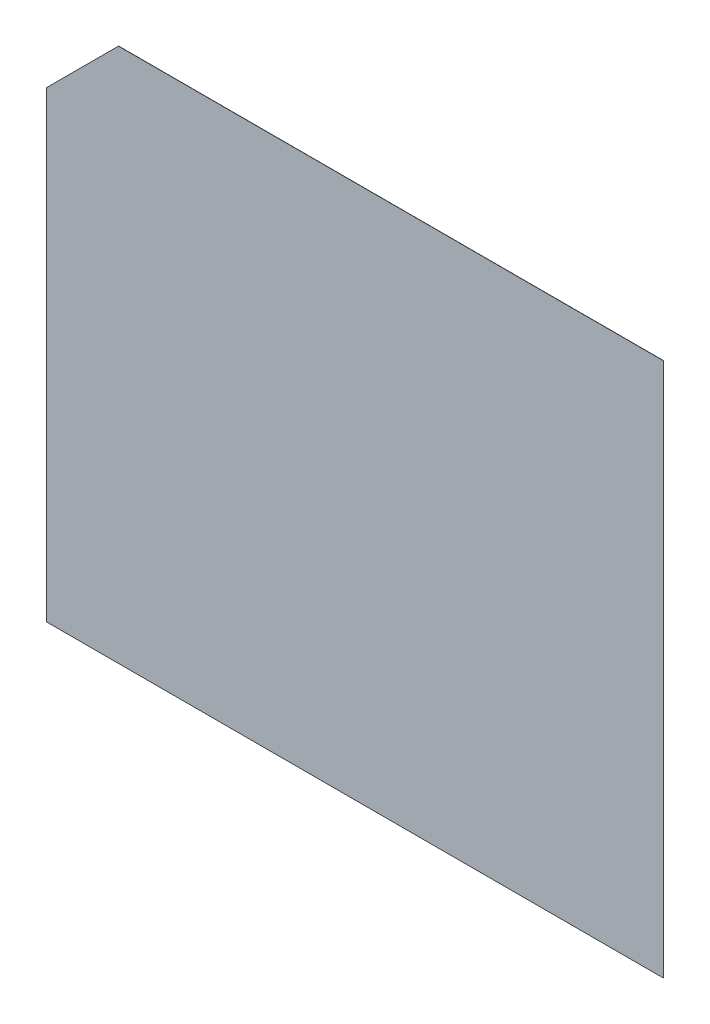
ISO-10303-21;
HEADER;
FILE_DESCRIPTION(('STEP AP214'),'2;1');
FILE_NAME('part.step','',(''),(''),'','','');
FILE_SCHEMA(('AUTOMOTIVE_DESIGN { 1 0 10303 214 1 1 1 1 }'));
ENDSEC;
DATA;
#1=APPLICATION_CONTEXT('core data for automotive mechanical design processes');
#2=APPLICATION_PROTOCOL_DEFINITION('international standard','automotive_design',2000,#1);
#3=PRODUCT_CONTEXT('',#1,'mechanical');
#4=PRODUCT('Part','Part','',(#3));
#5=PRODUCT_RELATED_PRODUCT_CATEGORY('part','',(#4));
#6=PRODUCT_DEFINITION_FORMATION('','',#4);
#7=PRODUCT_DEFINITION_CONTEXT('part definition',#1,'design');
#8=PRODUCT_DEFINITION('design','',#6,#7);
#9=PRODUCT_DEFINITION_SHAPE('','',#8);
#10=(LENGTH_UNIT() NAMED_UNIT(*) SI_UNIT(.MILLI.,.METRE.));
#11=(NAMED_UNIT(*) PLANE_ANGLE_UNIT() SI_UNIT($,.RADIAN.));
#12=(NAMED_UNIT(*) SI_UNIT($,.STERADIAN.) SOLID_ANGLE_UNIT());
#13=UNCERTAINTY_MEASURE_WITH_UNIT(LENGTH_MEASURE(1.E-05),#10,'distance_accuracy_value','');
#14=(GEOMETRIC_REPRESENTATION_CONTEXT(3) GLOBAL_UNCERTAINTY_ASSIGNED_CONTEXT((#13)) GLOBAL_UNIT_ASSIGNED_CONTEXT((#10,
#11,#12)) REPRESENTATION_CONTEXT('',''));
#15=CARTESIAN_POINT('',(0.,0.,0.));
#16=DIRECTION('',(0.,0.,1.));
#17=DIRECTION('',(1.,0.,0.));
#18=AXIS2_PLACEMENT_3D('',#15,#16,#17);
#19=CARTESIAN_POINT('',(-23.5424433175421,-3.51260628656114,-9.90996384610974E-05));
#20=CARTESIAN_POINT('',(-23.5424433175421,-3.51260628666604,0.00110090036153906));
#21=CARTESIAN_POINT('',(-23.5424431811625,-0.392606286561145,-9.88268795312018E-05));
#22=CARTESIAN_POINT('',(-23.5424431811625,-0.392606286666052,0.00110117312046896));
#23=(BOUNDED_SURFACE() B_SPLINE_SURFACE(1,1,((#19,#20),(#21,#22)),.UNSPECIFIED.,.F.,.F.,
.F.) B_SPLINE_SURFACE_WITH_KNOTS((2,2),(2,2),(-0.00026,0.00286),(-1.10000000000015E-06,
1.00000000000014E-07),
.UNSPECIFIED.) GEOMETRIC_REPRESENTATION_ITEM() RATIONAL_B_SPLINE_SURFACE(((1.,1.),(1.,1.))) REPRESENTATION_ITEM('') SURFACE());
#24=CARTESIAN_POINT('',(-23.5424431925275,-0.652606286657309,0.00100115039055812));
#25=CARTESIAN_POINT('',(-23.5424433061771,-3.2526062866573,0.00100092309144987));
#26=(BOUNDED_CURVE() B_SPLINE_CURVE(1,(#24,#25),.UNSPECIFIED.,.F.,
.F.) B_SPLINE_CURVE_WITH_KNOTS((2,2),(0.,0.0026),
.UNSPECIFIED.) CURVE() GEOMETRIC_REPRESENTATION_ITEM() RATIONAL_B_SPLINE_CURVE((1.,1.)) REPRESENTATION_ITEM(''));
#27=CARTESIAN_POINT('',(-23.5424431925275,-0.652606286657309,0.00100115039055812));
#28=VERTEX_POINT('',#27);
#29=CARTESIAN_POINT('',(-23.542443306177,-3.2526062866573,0.00100092309144976));
#30=VERTEX_POINT('',#29);
#31=EDGE_CURVE('E116',#28,#30,#26,.T.);
#32=CARTESIAN_POINT('',(-23.542443306177,-3.2526062866573,0.00100092309144976));
#33=CARTESIAN_POINT('',(-23.542443306177,-3.25260628656988,9.23091450066437E-07));
#34=(BOUNDED_CURVE() B_SPLINE_CURVE(1,(#32,#33),.UNSPECIFIED.,.F.,
.F.) B_SPLINE_CURVE_WITH_KNOTS((2,2),(0.,9.99999999999694E-07),
.UNSPECIFIED.) CURVE() GEOMETRIC_REPRESENTATION_ITEM() RATIONAL_B_SPLINE_CURVE((1.,1.)) REPRESENTATION_ITEM(''));
#35=CARTESIAN_POINT('',(-23.542443306177,-3.25260628656988,9.23091450066166E-07));
#36=VERTEX_POINT('',#35);
#37=EDGE_CURVE('E11',#30,#36,#34,.T.);
#38=CARTESIAN_POINT('',(-23.5424431925275,-0.652606286569893,1.1503905579871E-06));
#39=CARTESIAN_POINT('',(-23.5424433061771,-3.25260628656988,9.23091449740737E-07));
#40=(BOUNDED_CURVE() B_SPLINE_CURVE(1,(#38,#39),.UNSPECIFIED.,.F.,
.F.) B_SPLINE_CURVE_WITH_KNOTS((2,2),(0.,0.0026),
.UNSPECIFIED.) CURVE() GEOMETRIC_REPRESENTATION_ITEM() RATIONAL_B_SPLINE_CURVE((1.,1.)) REPRESENTATION_ITEM(''));
#41=CARTESIAN_POINT('',(-23.5424431925275,-0.652606286569893,1.1503905579871E-06));
#42=VERTEX_POINT('',#41);
#43=EDGE_CURVE('E101',#42,#36,#40,.T.);
#44=CARTESIAN_POINT('',(-23.5424431925275,-0.652606286657309,0.00100115039055812));
#45=CARTESIAN_POINT('',(-23.5424431925275,-0.652606286569886,1.15039055798751E-06));
#46=(BOUNDED_CURVE() B_SPLINE_CURVE(1,(#44,#45),.UNSPECIFIED.,.F.,
.F.) B_SPLINE_CURVE_WITH_KNOTS((2,2),(0.,1.00000000000013E-06),
.UNSPECIFIED.) CURVE() GEOMETRIC_REPRESENTATION_ITEM() RATIONAL_B_SPLINE_CURVE((1.,1.)) REPRESENTATION_ITEM(''));
#47=EDGE_CURVE('E73',#28,#42,#46,.T.);
#48=ORIENTED_EDGE('',*,*,#31,.T.);
#49=ORIENTED_EDGE('',*,*,#37,.T.);
#50=ORIENTED_EDGE('',*,*,#43,.F.);
#51=ORIENTED_EDGE('',*,*,#47,.F.);
#52=EDGE_LOOP('',(#48,#49,#50,#51));
#53=FACE_BOUND('',#52,.T.);
#54=ADVANCED_FACE('F17',(#53),#23,.T.);
#55=CARTESIAN_POINT('',(-26.842443306177,-3.25260614231355,-9.90769085375239E-05));
#56=CARTESIAN_POINT('',(-26.842443306177,-3.25260614241846,0.00110092309146263));
#57=CARTESIAN_POINT('',(-23.242443306177,-3.25260629967455,-9.90769085512808E-05));
#58=CARTESIAN_POINT('',(-23.242443306177,-3.25260629977946,0.00110092309144887));
#59=(BOUNDED_SURFACE() B_SPLINE_SURFACE(1,1,((#55,#56),(#57,#58)),.UNSPECIFIED.,.F.,.F.,
.F.) B_SPLINE_SURFACE_WITH_KNOTS((2,2),(2,2),(-0.0003,0.0033),(-1.0999999999999E-06,
1.00000000000259E-07),
.UNSPECIFIED.) GEOMETRIC_REPRESENTATION_ITEM() RATIONAL_B_SPLINE_SURFACE(((1.,1.),(1.,1.))) REPRESENTATION_ITEM('') SURFACE());
#60=CARTESIAN_POINT('',(-23.542443306177,-3.2526062866573,0.00100092309144976));
#61=CARTESIAN_POINT('',(-26.542443306177,-3.25260615552313,0.00100092309146122));
#62=(BOUNDED_CURVE() B_SPLINE_CURVE(1,(#60,#61),.UNSPECIFIED.,.F.,
.F.) B_SPLINE_CURVE_WITH_KNOTS((2,2),(0.,0.003),
.UNSPECIFIED.) CURVE() GEOMETRIC_REPRESENTATION_ITEM() RATIONAL_B_SPLINE_CURVE((1.,1.)) REPRESENTATION_ITEM(''));
#63=CARTESIAN_POINT('',(-26.542443306177,-3.25260615552314,0.00100092309146147));
#64=VERTEX_POINT('',#63);
#65=EDGE_CURVE('E153',#30,#64,#62,.T.);
#66=CARTESIAN_POINT('',(-26.542443306177,-3.25260615552314,0.00100092309146147));
#67=CARTESIAN_POINT('',(-26.542443306177,-3.25260615543572,9.23091461342275E-07));
#68=(BOUNDED_CURVE() B_SPLINE_CURVE(1,(#66,#67),.UNSPECIFIED.,.F.,
.F.) B_SPLINE_CURVE_WITH_KNOTS((2,2),(0.,1.00000000000013E-06),
.UNSPECIFIED.) CURVE() GEOMETRIC_REPRESENTATION_ITEM() RATIONAL_B_SPLINE_CURVE((1.,1.)) REPRESENTATION_ITEM(''));
#69=CARTESIAN_POINT('',(-26.542443306177,-3.25260615543571,9.23091461341868E-07));
#70=VERTEX_POINT('',#69);
#71=EDGE_CURVE('E31',#64,#70,#68,.T.);
#72=CARTESIAN_POINT('',(-23.542443306177,-3.25260628656988,9.23091450066166E-07));
#73=CARTESIAN_POINT('',(-26.542443306177,-3.25260615543572,9.23091461530274E-07));
#74=(BOUNDED_CURVE() B_SPLINE_CURVE(1,(#72,#73),.UNSPECIFIED.,.F.,
.F.) B_SPLINE_CURVE_WITH_KNOTS((2,2),(0.,0.003),
.UNSPECIFIED.) CURVE() GEOMETRIC_REPRESENTATION_ITEM() RATIONAL_B_SPLINE_CURVE((1.,1.)) REPRESENTATION_ITEM(''));
#75=EDGE_CURVE('E96',#36,#70,#74,.T.);
#76=ORIENTED_EDGE('',*,*,#65,.T.);
#77=ORIENTED_EDGE('',*,*,#71,.T.);
#78=ORIENTED_EDGE('',*,*,#75,.F.);
#79=ORIENTED_EDGE('',*,*,#37,.F.);
#80=EDGE_LOOP('',(#76,#77,#78,#79));
#81=FACE_BOUND('',#80,.T.);
#82=ADVANCED_FACE('F199',(#81),#59,.T.);
#83=CARTESIAN_POINT('',(-26.5424431979913,-0.777606155426974,-9.88605372721672E-05));
#84=CARTESIAN_POINT('',(-26.5424431979913,-0.777606155531881,0.00110113946272799));
#85=CARTESIAN_POINT('',(-26.5424433160121,-3.47760615542698,-9.90965786538077E-05));
#86=CARTESIAN_POINT('',(-26.5424433160121,-3.47760615553188,0.00110090342134635));
#87=(BOUNDED_SURFACE() B_SPLINE_SURFACE(1,1,((#83,#84),(#85,#86)),.UNSPECIFIED.,.F.,.F.,
.F.) B_SPLINE_SURFACE_WITH_KNOTS((2,2),(2,2),(-0.000225,0.002475),(-1.10000000000015E-06,
1.00000000000013E-07),
.UNSPECIFIED.) GEOMETRIC_REPRESENTATION_ITEM() RATIONAL_B_SPLINE_SURFACE(((1.,1.),(1.,1.))) REPRESENTATION_ITEM('') SURFACE());
#88=CARTESIAN_POINT('',(-26.542443306177,-3.25260615552314,0.00100092309146147));
#89=CARTESIAN_POINT('',(-26.5424432078264,-1.00260615552314,0.00100111979261284));
#90=(BOUNDED_CURVE() B_SPLINE_CURVE(1,(#88,#89),.UNSPECIFIED.,.F.,
.F.) B_SPLINE_CURVE_WITH_KNOTS((2,2),(0.,0.00225),
.UNSPECIFIED.) CURVE() GEOMETRIC_REPRESENTATION_ITEM() RATIONAL_B_SPLINE_CURVE((1.,1.)) REPRESENTATION_ITEM(''));
#91=CARTESIAN_POINT('',(-26.5424432078265,-1.00260615552314,0.0010011197926125));
#92=VERTEX_POINT('',#91);
#93=EDGE_CURVE('E145',#64,#92,#90,.T.);
#94=CARTESIAN_POINT('',(-26.5424432078265,-1.00260615552314,0.0010011197926125));
#95=CARTESIAN_POINT('',(-26.5424432078265,-1.00260615543572,1.119792612803E-06));
#96=(BOUNDED_CURVE() B_SPLINE_CURVE(1,(#94,#95),.UNSPECIFIED.,.F.,
.F.) B_SPLINE_CURVE_WITH_KNOTS((2,2),(0.,9.99999999999697E-07),
.UNSPECIFIED.) CURVE() GEOMETRIC_REPRESENTATION_ITEM() RATIONAL_B_SPLINE_CURVE((1.,1.)) REPRESENTATION_ITEM(''));
#97=CARTESIAN_POINT('',(-26.5424432078265,-1.00260615543572,1.11979261280259E-06));
#98=VERTEX_POINT('',#97);
#99=EDGE_CURVE('E72',#92,#98,#96,.T.);
#100=CARTESIAN_POINT('',(-26.542443306177,-3.25260615543571,9.23091461341868E-07));
#101=CARTESIAN_POINT('',(-26.5424432078264,-1.00260615543572,1.11979261270891E-06));
#102=(BOUNDED_CURVE() B_SPLINE_CURVE(1,(#100,#101),.UNSPECIFIED.,.F.,
.F.) B_SPLINE_CURVE_WITH_KNOTS((2,2),(0.,0.00225),
.UNSPECIFIED.) CURVE() GEOMETRIC_REPRESENTATION_ITEM() RATIONAL_B_SPLINE_CURVE((1.,1.)) REPRESENTATION_ITEM(''));
#103=EDGE_CURVE('E90',#70,#98,#102,.T.);
#104=ORIENTED_EDGE('',*,*,#93,.T.);
#105=ORIENTED_EDGE('',*,*,#99,.T.);
#106=ORIENTED_EDGE('',*,*,#103,.F.);
#107=ORIENTED_EDGE('',*,*,#71,.F.);
#108=EDGE_LOOP('',(#104,#105,#106,#107));
#109=FACE_BOUND('',#108,.T.);
#110=ADVANCED_FACE('F201',(#109),#87,.T.);
#111=CARTESIAN_POINT('',(-26.1574431909976,-0.617606172255853,-9.88465496360762E-05));
#112=CARTESIAN_POINT('',(-26.1574431909976,-0.61760617236076,0.00110115345036362));
#113=CARTESIAN_POINT('',(-26.5774432093564,-1.03760615389708,-9.88832671827263E-05));
#114=CARTESIAN_POINT('',(-26.5774432093564,-1.03760615400199,0.00110111673281697));
#115=(BOUNDED_SURFACE() B_SPLINE_SURFACE(1,1,((#111,#112),(#113,#114)),.UNSPECIFIED.,.F.,.F.,
.F.) B_SPLINE_SURFACE_WITH_KNOTS((2,2),(2,2),(-4.94974746830633E-05,0.000544472221513654),
(-1.09999999999968E-06,1.00000000000023E-07),
.UNSPECIFIED.) GEOMETRIC_REPRESENTATION_ITEM() RATIONAL_B_SPLINE_SURFACE(((1.,1.),(1.,1.))) REPRESENTATION_ITEM('') SURFACE());
#116=CARTESIAN_POINT('',(-26.5424432078265,-1.00260615552314,0.0010011197926125));
#117=CARTESIAN_POINT('',(-26.1924431925275,-0.652606170822123,0.00100115039056804));
#118=(BOUNDED_CURVE() B_SPLINE_CURVE(1,(#116,#117),.UNSPECIFIED.,.F.,
.F.) B_SPLINE_CURVE_WITH_KNOTS((2,2),(0.,0.000494974746830588),
.UNSPECIFIED.) CURVE() GEOMETRIC_REPRESENTATION_ITEM() RATIONAL_B_SPLINE_CURVE((1.,1.)) REPRESENTATION_ITEM(''));
#119=CARTESIAN_POINT('',(-26.1924431925275,-0.652606170822134,0.00100115039056809));
#120=VERTEX_POINT('',#119);
#121=EDGE_CURVE('E67',#92,#120,#118,.T.);
#122=CARTESIAN_POINT('',(-26.1924431925275,-0.652606170822134,0.00100115039056809));
#123=CARTESIAN_POINT('',(-26.1924431925275,-0.652606170734711,1.15039056839571E-06));
#124=(BOUNDED_CURVE() B_SPLINE_CURVE(1,(#122,#123),.UNSPECIFIED.,.F.,
.F.) B_SPLINE_CURVE_WITH_KNOTS((2,2),(0.,9.99999999999694E-07),
.UNSPECIFIED.) CURVE() GEOMETRIC_REPRESENTATION_ITEM() RATIONAL_B_SPLINE_CURVE((1.,1.)) REPRESENTATION_ITEM(''));
#125=CARTESIAN_POINT('',(-26.1924431925275,-0.652606170734704,1.15039056839544E-06));
#126=VERTEX_POINT('',#125);
#127=EDGE_CURVE('E60',#120,#126,#124,.T.);
#128=CARTESIAN_POINT('',(-26.5424432078265,-1.00260615543572,1.11979261280259E-06));
#129=CARTESIAN_POINT('',(-26.1924431925275,-0.652606170734698,1.15039056834443E-06));
#130=(BOUNDED_CURVE() B_SPLINE_CURVE(1,(#128,#129),.UNSPECIFIED.,.F.,
.F.) B_SPLINE_CURVE_WITH_KNOTS((2,2),(0.,0.000494974746830595),
.UNSPECIFIED.) CURVE() GEOMETRIC_REPRESENTATION_ITEM() RATIONAL_B_SPLINE_CURVE((1.,1.)) REPRESENTATION_ITEM(''));
#131=EDGE_CURVE('E22',#98,#126,#130,.T.);
#132=ORIENTED_EDGE('',*,*,#121,.T.);
#133=ORIENTED_EDGE('',*,*,#127,.T.);
#134=ORIENTED_EDGE('',*,*,#131,.F.);
#135=ORIENTED_EDGE('',*,*,#99,.F.);
#136=EDGE_LOOP('',(#132,#133,#134,#135));
#137=FACE_BOUND('',#136,.T.);
#138=ADVANCED_FACE('F62',(#137),#115,.T.);
#139=CARTESIAN_POINT('',(-23.2774431925275,-0.652606298144666,-9.88496094430384E-05));
#140=CARTESIAN_POINT('',(-23.2774431925275,-0.652606298249573,0.00110115039055712));
#141=CARTESIAN_POINT('',(-26.4574431925275,-0.652606159142451,-9.88496094308865E-05));
#142=CARTESIAN_POINT('',(-26.4574431925275,-0.652606159247358,0.00110115039056927));
#143=(BOUNDED_SURFACE() B_SPLINE_SURFACE(1,1,((#139,#140),(#141,#142)),.UNSPECIFIED.,.F.,.F.,
.F.) B_SPLINE_SURFACE_WITH_KNOTS((2,2),(2,2),(-0.000265,0.002915),(-1.1E-06,
1.0000000000017E-07),
.UNSPECIFIED.) GEOMETRIC_REPRESENTATION_ITEM() RATIONAL_B_SPLINE_SURFACE(((1.,1.),(1.,1.))) REPRESENTATION_ITEM('') SURFACE());
#144=CARTESIAN_POINT('',(-26.1924431925275,-0.652606170822134,0.00100115039056809));
#145=CARTESIAN_POINT('',(-23.5424431925275,-0.652606286657313,0.00100115039055796));
#146=(BOUNDED_CURVE() B_SPLINE_CURVE(1,(#144,#145),.UNSPECIFIED.,.F.,
.F.) B_SPLINE_CURVE_WITH_KNOTS((2,2),(0.,0.00265),
.UNSPECIFIED.) CURVE() GEOMETRIC_REPRESENTATION_ITEM() RATIONAL_B_SPLINE_CURVE((1.,1.)) REPRESENTATION_ITEM(''));
#147=EDGE_CURVE('E85',#120,#28,#146,.T.);
#148=CARTESIAN_POINT('',(-26.1924431925275,-0.652606170734704,1.15039056839544E-06));
#149=CARTESIAN_POINT('',(-23.5424431925275,-0.652606286569883,1.15039055826881E-06));
#150=(BOUNDED_CURVE() B_SPLINE_CURVE(1,(#148,#149),.UNSPECIFIED.,.F.,
.F.) B_SPLINE_CURVE_WITH_KNOTS((2,2),(0.,0.00265),
.UNSPECIFIED.) CURVE() GEOMETRIC_REPRESENTATION_ITEM() RATIONAL_B_SPLINE_CURVE((1.,1.)) REPRESENTATION_ITEM(''));
#151=EDGE_CURVE('E77',#126,#42,#150,.T.);
#152=ORIENTED_EDGE('',*,*,#147,.T.);
#153=ORIENTED_EDGE('',*,*,#47,.T.);
#154=ORIENTED_EDGE('',*,*,#151,.F.);
#155=ORIENTED_EDGE('',*,*,#127,.F.);
#156=EDGE_LOOP('',(#152,#153,#154,#155));
#157=FACE_BOUND('',#156,.T.);
#158=ADVANCED_FACE('F78',(#157),#143,.T.);
#159=CARTESIAN_POINT('',(-23.2424433175419,-3.51260629977072,0.0010009003615379));
#160=CARTESIAN_POINT('',(-26.8424433175421,-3.51260614240972,0.00100090036155166));
#161=CARTESIAN_POINT('',(-23.2424431811624,-0.392606299770719,0.0010011731204678));
#162=CARTESIAN_POINT('',(-26.8424431811626,-0.392606142409721,0.00100117312048156));
#163=(BOUNDED_SURFACE() B_SPLINE_SURFACE(1,1,((#159,#160),(#161,#162)),.UNSPECIFIED.,.F.,.F.,
.F.) B_SPLINE_SURFACE_WITH_KNOTS((2,2),(2,2),(-0.00286,0.000260000000000008),
(-0.000300000000000124,0.0033),
.UNSPECIFIED.) GEOMETRIC_REPRESENTATION_ITEM() RATIONAL_B_SPLINE_SURFACE(((1.,1.),(1.,1.))) REPRESENTATION_ITEM('') SURFACE());
#164=ORIENTED_EDGE('',*,*,#147,.F.);
#165=ORIENTED_EDGE('',*,*,#121,.F.);
#166=ORIENTED_EDGE('',*,*,#93,.F.);
#167=ORIENTED_EDGE('',*,*,#65,.F.);
#168=ORIENTED_EDGE('',*,*,#31,.F.);
#169=EDGE_LOOP('',(#164,#165,#166,#167,#168));
#170=FACE_BOUND('',#169,.T.);
#171=ADVANCED_FACE('F198',(#170),#163,.T.);
#172=CARTESIAN_POINT('',(-23.2424431811624,-0.392606299683293,1.17312046766533E-06));
#173=CARTESIAN_POINT('',(-26.8424431811626,-0.392606142322296,1.17312048142226E-06));
#174=CARTESIAN_POINT('',(-23.2424433175419,-3.5126062996833,9.00361537769689E-07));
#175=CARTESIAN_POINT('',(-26.8424433175421,-3.5126061423223,9.00361551526619E-07));
#176=(BOUNDED_SURFACE() B_SPLINE_SURFACE(1,1,((#172,#173),(#174,#175)),.UNSPECIFIED.,.F.,.F.,
.F.) B_SPLINE_SURFACE_WITH_KNOTS((2,2),(2,2),(-0.00286,0.000260000000000017),
(-0.000300000000000124,0.0033),
.UNSPECIFIED.) GEOMETRIC_REPRESENTATION_ITEM() RATIONAL_B_SPLINE_SURFACE(((1.,1.),(1.,1.))) REPRESENTATION_ITEM('') SURFACE());
#177=ORIENTED_EDGE('',*,*,#43,.T.);
#178=ORIENTED_EDGE('',*,*,#75,.T.);
#179=ORIENTED_EDGE('',*,*,#103,.T.);
#180=ORIENTED_EDGE('',*,*,#131,.T.);
#181=ORIENTED_EDGE('',*,*,#151,.T.);
#182=EDGE_LOOP('',(#177,#178,#179,#180,#181));
#183=FACE_BOUND('',#182,.T.);
#184=ADVANCED_FACE('F87',(#183),#176,.T.);
#185=CLOSED_SHELL('',(#54,#82,#110,#138,#158,#171,#184));
#186=MANIFOLD_SOLID_BREP('B1',#185);
#187=ADVANCED_BREP_SHAPE_REPRESENTATION('',(#18,#186),#14);
#188=SHAPE_DEFINITION_REPRESENTATION(#9,#187);
ENDSEC;
END-ISO-10303-21;
